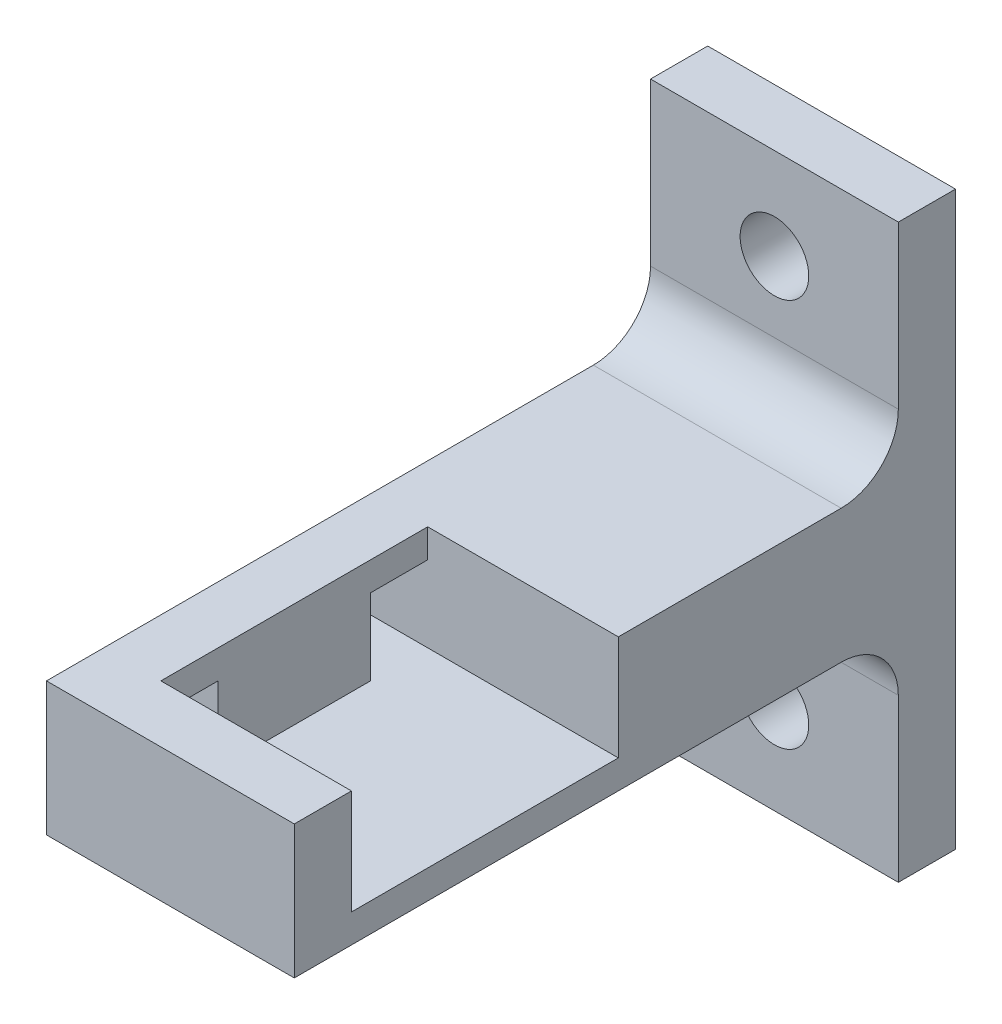
ISO-10303-21;
HEADER;
FILE_DESCRIPTION(('STEP AP214'),'2;1');
FILE_NAME('part.step','',(''),(''),'','','');
FILE_SCHEMA(('AUTOMOTIVE_DESIGN { 1 0 10303 214 1 1 1 1 }'));
ENDSEC;
DATA;
#1=APPLICATION_CONTEXT('core data for automotive mechanical design processes');
#2=APPLICATION_PROTOCOL_DEFINITION('international standard','automotive_design',2000,#1);
#3=PRODUCT_CONTEXT('',#1,'mechanical');
#4=PRODUCT('Part','Part','',(#3));
#5=PRODUCT_RELATED_PRODUCT_CATEGORY('part','',(#4));
#6=PRODUCT_DEFINITION_FORMATION('','',#4);
#7=PRODUCT_DEFINITION_CONTEXT('part definition',#1,'design');
#8=PRODUCT_DEFINITION('design','',#6,#7);
#9=PRODUCT_DEFINITION_SHAPE('','',#8);
#10=(LENGTH_UNIT() NAMED_UNIT(*) SI_UNIT(.MILLI.,.METRE.));
#11=(NAMED_UNIT(*) PLANE_ANGLE_UNIT() SI_UNIT($,.RADIAN.));
#12=(NAMED_UNIT(*) SI_UNIT($,.STERADIAN.) SOLID_ANGLE_UNIT());
#13=UNCERTAINTY_MEASURE_WITH_UNIT(LENGTH_MEASURE(1.E-05),#10,'distance_accuracy_value','');
#14=(GEOMETRIC_REPRESENTATION_CONTEXT(3) GLOBAL_UNCERTAINTY_ASSIGNED_CONTEXT((#13)) GLOBAL_UNIT_ASSIGNED_CONTEXT((#10,
#11,#12)) REPRESENTATION_CONTEXT('',''));
#15=CARTESIAN_POINT('',(0.,0.,0.));
#16=DIRECTION('',(0.,0.,1.));
#17=DIRECTION('',(1.,0.,0.));
#18=AXIS2_PLACEMENT_3D('',#15,#16,#17);
#19=CARTESIAN_POINT('',(0.,0.,3.));
#20=DIRECTION('',(0.,0.,-1.));
#21=DIRECTION('',(-1.,0.,0.));
#22=AXIS2_PLACEMENT_3D('',#19,#20,#21);
#23=PLANE('',#22);
#24=CARTESIAN_POINT('',(6.5,25.2,3.));
#25=DIRECTION('',(0.,0.,1.));
#26=DIRECTION('',(1.,0.,0.));
#27=AXIS2_PLACEMENT_3D('',#24,#25,#26);
#28=CIRCLE('',#27,1.8);
#29=CARTESIAN_POINT('',(8.3,25.2,3.));
#30=VERTEX_POINT('',#29);
#31=EDGE_CURVE('E222',#30,#30,#28,.T.);
#32=ORIENTED_EDGE('',*,*,#31,.F.);
#33=EDGE_LOOP('',(#32));
#34=FACE_BOUND('',#33,.T.);
#35=DIRECTION('',(0.,-1.,0.));
#36=VECTOR('',#35,1.);
#37=CARTESIAN_POINT('',(0.,0.,3.));
#38=LINE('',#37,#36);
#39=CARTESIAN_POINT('',(0.,30.,3.));
#40=VERTEX_POINT('',#39);
#41=CARTESIAN_POINT('',(0.,21.5,3.));
#42=VERTEX_POINT('',#41);
#43=EDGE_CURVE('E238',#40,#42,#38,.T.);
#44=ORIENTED_EDGE('',*,*,#43,.T.);
#45=DIRECTION('',(-1.,0.,0.));
#46=VECTOR('',#45,1.);
#47=CARTESIAN_POINT('',(13.,21.5,3.));
#48=LINE('',#47,#46);
#49=CARTESIAN_POINT('',(13.,21.5,3.));
#50=VERTEX_POINT('',#49);
#51=EDGE_CURVE('E53',#42,#50,#48,.F.);
#52=ORIENTED_EDGE('',*,*,#51,.T.);
#53=DIRECTION('',(0.,1.,0.));
#54=VECTOR('',#53,1.);
#55=CARTESIAN_POINT('',(13.,0.,3.));
#56=LINE('',#55,#54);
#57=CARTESIAN_POINT('',(13.,30.,3.));
#58=VERTEX_POINT('',#57);
#59=EDGE_CURVE('E247',#50,#58,#56,.T.);
#60=ORIENTED_EDGE('',*,*,#59,.T.);
#61=DIRECTION('',(-1.,0.,0.));
#62=VECTOR('',#61,1.);
#63=CARTESIAN_POINT('',(0.,30.,3.));
#64=LINE('',#63,#62);
#65=EDGE_CURVE('E246',#58,#40,#64,.T.);
#66=ORIENTED_EDGE('',*,*,#65,.T.);
#67=EDGE_LOOP('',(#44,#52,#60,#66));
#68=FACE_BOUND('',#67,.T.);
#69=ADVANCED_FACE('F32',(#34,#68),#23,.F.);
#70=CARTESIAN_POINT('',(6.5,4.8,3.));
#71=DIRECTION('',(0.,0.,1.));
#72=DIRECTION('',(1.,0.,0.));
#73=AXIS2_PLACEMENT_3D('',#70,#71,#72);
#74=CIRCLE('',#73,1.8);
#75=CARTESIAN_POINT('',(8.3,4.8,3.));
#76=VERTEX_POINT('',#75);
#77=EDGE_CURVE('E214',#76,#76,#74,.T.);
#78=ORIENTED_EDGE('',*,*,#77,.F.);
#79=EDGE_LOOP('',(#78));
#80=FACE_BOUND('',#79,.T.);
#81=CARTESIAN_POINT('',(13.,0.,3.));
#82=VERTEX_POINT('',#81);
#83=CARTESIAN_POINT('',(13.,8.5,3.));
#84=VERTEX_POINT('',#83);
#85=EDGE_CURVE('E243',#82,#84,#56,.T.);
#86=ORIENTED_EDGE('',*,*,#85,.T.);
#87=DIRECTION('',(1.,0.,0.));
#88=VECTOR('',#87,1.);
#89=CARTESIAN_POINT('',(0.,8.5,3.));
#90=LINE('',#89,#88);
#91=CARTESIAN_POINT('',(0.,8.5,3.));
#92=VERTEX_POINT('',#91);
#93=EDGE_CURVE('E281',#84,#92,#90,.F.);
#94=ORIENTED_EDGE('',*,*,#93,.T.);
#95=CARTESIAN_POINT('',(0.,0.,3.));
#96=VERTEX_POINT('',#95);
#97=EDGE_CURVE('E234',#92,#96,#38,.T.);
#98=ORIENTED_EDGE('',*,*,#97,.T.);
#99=DIRECTION('',(1.,0.,0.));
#100=VECTOR('',#99,1.);
#101=CARTESIAN_POINT('',(0.,0.,3.));
#102=LINE('',#101,#100);
#103=EDGE_CURVE('E230',#96,#82,#102,.T.);
#104=ORIENTED_EDGE('',*,*,#103,.T.);
#105=EDGE_LOOP('',(#86,#94,#98,#104));
#106=FACE_BOUND('',#105,.T.);
#107=ADVANCED_FACE('F342',(#80,#106),#23,.F.);
#108=CARTESIAN_POINT('',(0.,0.,0.));
#109=DIRECTION('',(0.,0.,-1.));
#110=DIRECTION('',(-1.,0.,0.));
#111=AXIS2_PLACEMENT_3D('',#108,#109,#110);
#112=PLANE('',#111);
#113=CARTESIAN_POINT('',(6.5,25.2,0.));
#114=DIRECTION('',(0.,0.,1.));
#115=DIRECTION('',(1.,0.,0.));
#116=AXIS2_PLACEMENT_3D('',#113,#114,#115);
#117=CIRCLE('',#116,1.8);
#118=CARTESIAN_POINT('',(8.3,25.2,0.));
#119=VERTEX_POINT('',#118);
#120=EDGE_CURVE('E217',#119,#119,#117,.T.);
#121=ORIENTED_EDGE('',*,*,#120,.T.);
#122=EDGE_LOOP('',(#121));
#123=FACE_BOUND('',#122,.T.);
#124=DIRECTION('',(0.,-1.,0.));
#125=VECTOR('',#124,1.);
#126=CARTESIAN_POINT('',(0.,0.,0.));
#127=LINE('',#126,#125);
#128=CARTESIAN_POINT('',(0.,30.,0.));
#129=VERTEX_POINT('',#128);
#130=CARTESIAN_POINT('',(0.,0.,0.));
#131=VERTEX_POINT('',#130);
#132=EDGE_CURVE('E225',#129,#131,#127,.T.);
#133=ORIENTED_EDGE('',*,*,#132,.F.);
#134=DIRECTION('',(-1.,0.,0.));
#135=VECTOR('',#134,1.);
#136=CARTESIAN_POINT('',(0.,30.,0.));
#137=LINE('',#136,#135);
#138=CARTESIAN_POINT('',(13.,30.,0.));
#139=VERTEX_POINT('',#138);
#140=EDGE_CURVE('E322',#139,#129,#137,.T.);
#141=ORIENTED_EDGE('',*,*,#140,.F.);
#142=DIRECTION('',(0.,1.,0.));
#143=VECTOR('',#142,1.);
#144=CARTESIAN_POINT('',(13.,0.,0.));
#145=LINE('',#144,#143);
#146=CARTESIAN_POINT('',(13.,0.,0.));
#147=VERTEX_POINT('',#146);
#148=EDGE_CURVE('E332',#147,#139,#145,.T.);
#149=ORIENTED_EDGE('',*,*,#148,.F.);
#150=DIRECTION('',(1.,0.,0.));
#151=VECTOR('',#150,1.);
#152=CARTESIAN_POINT('',(0.,0.,0.));
#153=LINE('',#152,#151);
#154=EDGE_CURVE('E338',#131,#147,#153,.T.);
#155=ORIENTED_EDGE('',*,*,#154,.F.);
#156=EDGE_LOOP('',(#133,#141,#149,#155));
#157=FACE_BOUND('',#156,.T.);
#158=CARTESIAN_POINT('',(6.5,4.8,0.));
#159=DIRECTION('',(0.,0.,1.));
#160=DIRECTION('',(1.,0.,0.));
#161=AXIS2_PLACEMENT_3D('',#158,#159,#160);
#162=CIRCLE('',#161,1.8);
#163=CARTESIAN_POINT('',(8.3,4.8,0.));
#164=VERTEX_POINT('',#163);
#165=EDGE_CURVE('E218',#164,#164,#162,.T.);
#166=ORIENTED_EDGE('',*,*,#165,.T.);
#167=EDGE_LOOP('',(#166));
#168=FACE_BOUND('',#167,.T.);
#169=ADVANCED_FACE('F336',(#123,#157,#168),#112,.T.);
#170=CARTESIAN_POINT('',(0.,0.,3.));
#171=DIRECTION('',(1.,0.,0.));
#172=DIRECTION('',(0.,0.,-1.));
#173=AXIS2_PLACEMENT_3D('',#170,#171,#172);
#174=PLANE('',#173);
#175=DIRECTION('',(0.,0.,1.));
#176=VECTOR('',#175,1.);
#177=CARTESIAN_POINT('',(0.,17.,3.));
#178=LINE('',#177,#176);
#179=CARTESIAN_POINT('',(0.,17.,17.69));
#180=VERTEX_POINT('',#179);
#181=CARTESIAN_POINT('',(0.,17.,20.69));
#182=VERTEX_POINT('',#181);
#183=EDGE_CURVE('E175',#180,#182,#178,.T.);
#184=ORIENTED_EDGE('',*,*,#183,.T.);
#185=DIRECTION('',(0.,-1.,0.));
#186=VECTOR('',#185,1.);
#187=CARTESIAN_POINT('',(0.,0.,20.69));
#188=LINE('',#187,#186);
#189=CARTESIAN_POINT('',(0.,13.,20.69));
#190=VERTEX_POINT('',#189);
#191=EDGE_CURVE('E608',#182,#190,#188,.T.);
#192=ORIENTED_EDGE('',*,*,#191,.T.);
#193=DIRECTION('',(0.,0.,-1.));
#194=VECTOR('',#193,1.);
#195=CARTESIAN_POINT('',(0.,13.,3.00000000000001));
#196=LINE('',#195,#194);
#197=CARTESIAN_POINT('',(0.,13.,17.69));
#198=VERTEX_POINT('',#197);
#199=EDGE_CURVE('E605',#190,#198,#196,.T.);
#200=ORIENTED_EDGE('',*,*,#199,.T.);
#201=DIRECTION('',(0.,1.,0.));
#202=VECTOR('',#201,1.);
#203=CARTESIAN_POINT('',(0.,0.,17.69));
#204=LINE('',#203,#202);
#205=EDGE_CURVE('E611',#198,#180,#204,.T.);
#206=ORIENTED_EDGE('',*,*,#205,.T.);
#207=EDGE_LOOP('',(#184,#192,#200,#206));
#208=FACE_BOUND('',#207,.T.);
#209=DIRECTION('',(0.,0.,1.));
#210=VECTOR('',#209,1.);
#211=CARTESIAN_POINT('',(0.,17.,3.));
#212=LINE('',#211,#210);
#213=CARTESIAN_POINT('',(0.,17.,28.69));
#214=VERTEX_POINT('',#213);
#215=CARTESIAN_POINT('',(0.,17.,31.69));
#216=VERTEX_POINT('',#215);
#217=EDGE_CURVE('E582',#214,#216,#212,.T.);
#218=ORIENTED_EDGE('',*,*,#217,.T.);
#219=DIRECTION('',(0.,-1.,0.));
#220=VECTOR('',#219,1.);
#221=CARTESIAN_POINT('',(0.,0.,31.69));
#222=LINE('',#221,#220);
#223=CARTESIAN_POINT('',(0.,13.,31.69));
#224=VERTEX_POINT('',#223);
#225=EDGE_CURVE('E574',#216,#224,#222,.T.);
#226=ORIENTED_EDGE('',*,*,#225,.T.);
#227=DIRECTION('',(0.,0.,-1.));
#228=VECTOR('',#227,1.);
#229=CARTESIAN_POINT('',(0.,13.,3.));
#230=LINE('',#229,#228);
#231=CARTESIAN_POINT('',(0.,13.,28.69));
#232=VERTEX_POINT('',#231);
#233=EDGE_CURVE('E588',#224,#232,#230,.T.);
#234=ORIENTED_EDGE('',*,*,#233,.T.);
#235=DIRECTION('',(0.,1.,0.));
#236=VECTOR('',#235,1.);
#237=CARTESIAN_POINT('',(0.,0.,28.69));
#238=LINE('',#237,#236);
#239=EDGE_CURVE('E585',#232,#214,#238,.T.);
#240=ORIENTED_EDGE('',*,*,#239,.T.);
#241=EDGE_LOOP('',(#218,#226,#234,#240));
#242=FACE_BOUND('',#241,.T.);
#243=ORIENTED_EDGE('',*,*,#132,.T.);
#244=DIRECTION('',(0.,0.,-1.));
#245=VECTOR('',#244,1.);
#246=CARTESIAN_POINT('',(0.,0.,3.));
#247=LINE('',#246,#245);
#248=EDGE_CURVE('E241',#96,#131,#247,.T.);
#249=ORIENTED_EDGE('',*,*,#248,.F.);
#250=ORIENTED_EDGE('',*,*,#97,.F.);
#251=CARTESIAN_POINT('',(0.,8.5,6.));
#252=DIRECTION('',(1.,0.,0.));
#253=DIRECTION('',(0.,0.,-1.));
#254=AXIS2_PLACEMENT_3D('',#251,#252,#253);
#255=CIRCLE('',#254,3.);
#256=CARTESIAN_POINT('',(0.,11.5,6.));
#257=VERTEX_POINT('',#256);
#258=EDGE_CURVE('E261',#92,#257,#255,.T.);
#259=ORIENTED_EDGE('',*,*,#258,.T.);
#260=DIRECTION('',(0.,0.,-1.));
#261=VECTOR('',#260,1.);
#262=CARTESIAN_POINT('',(0.,11.5,34.69));
#263=LINE('',#262,#261);
#264=CARTESIAN_POINT('',(0.,11.5,34.69));
#265=VERTEX_POINT('',#264);
#266=EDGE_CURVE('E221',#265,#257,#263,.T.);
#267=ORIENTED_EDGE('',*,*,#266,.F.);
#268=DIRECTION('',(0.,-1.,0.));
#269=VECTOR('',#268,1.);
#270=CARTESIAN_POINT('',(0.,11.5,34.69));
#271=LINE('',#270,#269);
#272=CARTESIAN_POINT('',(0.,18.5,34.69));
#273=VERTEX_POINT('',#272);
#274=EDGE_CURVE('E204',#273,#265,#271,.T.);
#275=ORIENTED_EDGE('',*,*,#274,.F.);
#276=DIRECTION('',(0.,0.,-1.));
#277=VECTOR('',#276,1.);
#278=CARTESIAN_POINT('',(0.,18.5,34.69));
#279=LINE('',#278,#277);
#280=CARTESIAN_POINT('',(0.,18.5,6.));
#281=VERTEX_POINT('',#280);
#282=EDGE_CURVE('E213',#273,#281,#279,.T.);
#283=ORIENTED_EDGE('',*,*,#282,.T.);
#284=CARTESIAN_POINT('',(0.,21.5,6.));
#285=DIRECTION('',(1.,0.,0.));
#286=DIRECTION('',(0.,0.,-1.));
#287=AXIS2_PLACEMENT_3D('',#284,#285,#286);
#288=CIRCLE('',#287,3.);
#289=EDGE_CURVE('E40',#281,#42,#288,.T.);
#290=ORIENTED_EDGE('',*,*,#289,.T.);
#291=ORIENTED_EDGE('',*,*,#43,.F.);
#292=DIRECTION('',(0.,0.,-1.));
#293=VECTOR('',#292,1.);
#294=CARTESIAN_POINT('',(0.,30.,3.));
#295=LINE('',#294,#293);
#296=EDGE_CURVE('E318',#40,#129,#295,.T.);
#297=ORIENTED_EDGE('',*,*,#296,.T.);
#298=EDGE_LOOP('',(#243,#249,#250,#259,#267,#275,#283,#290,#291,#297));
#299=FACE_BOUND('',#298,.T.);
#300=ADVANCED_FACE('F267',(#208,#242,#299),#174,.F.);
#301=CARTESIAN_POINT('',(0.,0.,3.));
#302=DIRECTION('',(0.,1.,0.));
#303=DIRECTION('',(0.,0.,1.));
#304=AXIS2_PLACEMENT_3D('',#301,#302,#303);
#305=PLANE('',#304);
#306=ORIENTED_EDGE('',*,*,#154,.T.);
#307=DIRECTION('',(0.,0.,-1.));
#308=VECTOR('',#307,1.);
#309=CARTESIAN_POINT('',(13.,0.,3.));
#310=LINE('',#309,#308);
#311=EDGE_CURVE('E283',#82,#147,#310,.T.);
#312=ORIENTED_EDGE('',*,*,#311,.F.);
#313=ORIENTED_EDGE('',*,*,#103,.F.);
#314=ORIENTED_EDGE('',*,*,#248,.T.);
#315=EDGE_LOOP('',(#306,#312,#313,#314));
#316=FACE_BOUND('',#315,.T.);
#317=ADVANCED_FACE('F340',(#316),#305,.F.);
#318=CARTESIAN_POINT('',(13.,0.,3.));
#319=DIRECTION('',(-1.,0.,0.));
#320=DIRECTION('',(0.,0.,1.));
#321=AXIS2_PLACEMENT_3D('',#318,#319,#320);
#322=PLANE('',#321);
#323=DIRECTION('',(0.,0.,-1.));
#324=VECTOR('',#323,1.);
#325=CARTESIAN_POINT('',(13.,13.,31.69));
#326=LINE('',#325,#324);
#327=CARTESIAN_POINT('',(13.,13.,31.69));
#328=VERTEX_POINT('',#327);
#329=CARTESIAN_POINT('',(13.,13.,17.69));
#330=VERTEX_POINT('',#329);
#331=EDGE_CURVE('E566',#328,#330,#326,.T.);
#332=ORIENTED_EDGE('',*,*,#331,.F.);
#333=DIRECTION('',(0.,1.,0.));
#334=VECTOR('',#333,1.);
#335=CARTESIAN_POINT('',(13.,13.,31.69));
#336=LINE('',#335,#334);
#337=CARTESIAN_POINT('',(13.,18.5,31.69));
#338=VERTEX_POINT('',#337);
#339=EDGE_CURVE('E198',#328,#338,#336,.T.);
#340=ORIENTED_EDGE('',*,*,#339,.T.);
#341=DIRECTION('',(0.,0.,-1.));
#342=VECTOR('',#341,1.);
#343=CARTESIAN_POINT('',(13.,18.5,34.69));
#344=LINE('',#343,#342);
#345=CARTESIAN_POINT('',(13.,18.5,34.69));
#346=VERTEX_POINT('',#345);
#347=EDGE_CURVE('E288',#346,#338,#344,.T.);
#348=ORIENTED_EDGE('',*,*,#347,.F.);
#349=DIRECTION('',(0.,1.,0.));
#350=VECTOR('',#349,1.);
#351=CARTESIAN_POINT('',(13.,11.5,34.69));
#352=LINE('',#351,#350);
#353=CARTESIAN_POINT('',(13.,11.5,34.69));
#354=VERTEX_POINT('',#353);
#355=EDGE_CURVE('E209',#354,#346,#352,.T.);
#356=ORIENTED_EDGE('',*,*,#355,.F.);
#357=DIRECTION('',(0.,0.,-1.));
#358=VECTOR('',#357,1.);
#359=CARTESIAN_POINT('',(13.,11.5,34.69));
#360=LINE('',#359,#358);
#361=CARTESIAN_POINT('',(13.,11.5,6.));
#362=VERTEX_POINT('',#361);
#363=EDGE_CURVE('E248',#354,#362,#360,.T.);
#364=ORIENTED_EDGE('',*,*,#363,.T.);
#365=CARTESIAN_POINT('',(13.,8.5,6.));
#366=DIRECTION('',(-1.,0.,0.));
#367=DIRECTION('',(0.,0.,1.));
#368=AXIS2_PLACEMENT_3D('',#365,#366,#367);
#369=CIRCLE('',#368,3.);
#370=EDGE_CURVE('E259',#362,#84,#369,.T.);
#371=ORIENTED_EDGE('',*,*,#370,.T.);
#372=ORIENTED_EDGE('',*,*,#85,.F.);
#373=ORIENTED_EDGE('',*,*,#311,.T.);
#374=ORIENTED_EDGE('',*,*,#148,.T.);
#375=DIRECTION('',(0.,0.,-1.));
#376=VECTOR('',#375,1.);
#377=CARTESIAN_POINT('',(13.,30.,3.));
#378=LINE('',#377,#376);
#379=EDGE_CURVE('E314',#58,#139,#378,.T.);
#380=ORIENTED_EDGE('',*,*,#379,.F.);
#381=ORIENTED_EDGE('',*,*,#59,.F.);
#382=CARTESIAN_POINT('',(13.,21.5,6.));
#383=DIRECTION('',(-1.,0.,0.));
#384=DIRECTION('',(0.,0.,1.));
#385=AXIS2_PLACEMENT_3D('',#382,#383,#384);
#386=CIRCLE('',#385,3.);
#387=CARTESIAN_POINT('',(13.,18.5,6.));
#388=VERTEX_POINT('',#387);
#389=EDGE_CURVE('E11',#50,#388,#386,.T.);
#390=ORIENTED_EDGE('',*,*,#389,.T.);
#391=CARTESIAN_POINT('',(13.,18.5,17.69));
#392=VERTEX_POINT('',#391);
#393=EDGE_CURVE('E285',#392,#388,#344,.T.);
#394=ORIENTED_EDGE('',*,*,#393,.F.);
#395=DIRECTION('',(0.,1.,0.));
#396=VECTOR('',#395,1.);
#397=CARTESIAN_POINT('',(13.,13.,17.69));
#398=LINE('',#397,#396);
#399=EDGE_CURVE('E196',#330,#392,#398,.T.);
#400=ORIENTED_EDGE('',*,*,#399,.F.);
#401=EDGE_LOOP('',(#332,#340,#348,#356,#364,#371,#372,#373,#374,#380,#381,#390,#394,#400));
#402=FACE_BOUND('',#401,.T.);
#403=ADVANCED_FACE('F310',(#402),#322,.F.);
#404=CARTESIAN_POINT('',(0.,30.,3.));
#405=DIRECTION('',(0.,-1.,0.));
#406=DIRECTION('',(0.,0.,-1.));
#407=AXIS2_PLACEMENT_3D('',#404,#405,#406);
#408=PLANE('',#407);
#409=ORIENTED_EDGE('',*,*,#140,.T.);
#410=ORIENTED_EDGE('',*,*,#296,.F.);
#411=ORIENTED_EDGE('',*,*,#65,.F.);
#412=ORIENTED_EDGE('',*,*,#379,.T.);
#413=EDGE_LOOP('',(#409,#410,#411,#412));
#414=FACE_BOUND('',#413,.T.);
#415=ADVANCED_FACE('F320',(#414),#408,.F.);
#416=CARTESIAN_POINT('',(6.5,25.2,3.));
#417=DIRECTION('',(0.,0.,-1.));
#418=DIRECTION('',(-1.,0.,0.));
#419=AXIS2_PLACEMENT_3D('',#416,#417,#418);
#420=CYLINDRICAL_SURFACE('',#419,1.8);
#421=ORIENTED_EDGE('',*,*,#31,.T.);
#422=EDGE_LOOP('',(#421));
#423=FACE_BOUND('',#422,.T.);
#424=ORIENTED_EDGE('',*,*,#120,.F.);
#425=EDGE_LOOP('',(#424));
#426=FACE_BOUND('',#425,.T.);
#427=ADVANCED_FACE('F355',(#423,#426),#420,.F.);
#428=CARTESIAN_POINT('',(6.5,4.8,3.));
#429=DIRECTION('',(0.,0.,-1.));
#430=DIRECTION('',(-1.,0.,0.));
#431=AXIS2_PLACEMENT_3D('',#428,#429,#430);
#432=CYLINDRICAL_SURFACE('',#431,1.8);
#433=ORIENTED_EDGE('',*,*,#77,.T.);
#434=EDGE_LOOP('',(#433));
#435=FACE_BOUND('',#434,.T.);
#436=ORIENTED_EDGE('',*,*,#165,.F.);
#437=EDGE_LOOP('',(#436));
#438=FACE_BOUND('',#437,.T.);
#439=ADVANCED_FACE('F406',(#435,#438),#432,.F.);
#440=CARTESIAN_POINT('',(0.,11.5,34.69));
#441=DIRECTION('',(0.,1.,0.));
#442=DIRECTION('',(0.,0.,1.));
#443=AXIS2_PLACEMENT_3D('',#440,#441,#442);
#444=PLANE('',#443);
#445=ORIENTED_EDGE('',*,*,#266,.T.);
#446=DIRECTION('',(1.,0.,0.));
#447=VECTOR('',#446,1.);
#448=CARTESIAN_POINT('',(13.,11.5,6.));
#449=LINE('',#448,#447);
#450=EDGE_CURVE('E277',#257,#362,#449,.T.);
#451=ORIENTED_EDGE('',*,*,#450,.T.);
#452=ORIENTED_EDGE('',*,*,#363,.F.);
#453=DIRECTION('',(1.,0.,0.));
#454=VECTOR('',#453,1.);
#455=CARTESIAN_POINT('',(0.,11.5,34.69));
#456=LINE('',#455,#454);
#457=EDGE_CURVE('E207',#265,#354,#456,.T.);
#458=ORIENTED_EDGE('',*,*,#457,.F.);
#459=EDGE_LOOP('',(#445,#451,#452,#458));
#460=FACE_BOUND('',#459,.T.);
#461=ADVANCED_FACE('F275',(#460),#444,.F.);
#462=CARTESIAN_POINT('',(0.,18.5,34.69));
#463=DIRECTION('',(0.,-1.,0.));
#464=DIRECTION('',(1.,0.,0.));
#465=AXIS2_PLACEMENT_3D('',#462,#463,#464);
#466=PLANE('',#465);
#467=ORIENTED_EDGE('',*,*,#393,.T.);
#468=DIRECTION('',(-1.,0.,0.));
#469=VECTOR('',#468,1.);
#470=CARTESIAN_POINT('',(0.,18.5,6.));
#471=LINE('',#470,#469);
#472=EDGE_CURVE('E257',#388,#281,#471,.T.);
#473=ORIENTED_EDGE('',*,*,#472,.T.);
#474=ORIENTED_EDGE('',*,*,#282,.F.);
#475=DIRECTION('',(-1.,0.,0.));
#476=VECTOR('',#475,1.);
#477=CARTESIAN_POINT('',(0.,18.5,34.69));
#478=LINE('',#477,#476);
#479=EDGE_CURVE('E211',#346,#273,#478,.T.);
#480=ORIENTED_EDGE('',*,*,#479,.F.);
#481=ORIENTED_EDGE('',*,*,#347,.T.);
#482=DIRECTION('',(1.,0.,0.));
#483=VECTOR('',#482,1.);
#484=CARTESIAN_POINT('',(13.,18.5,31.69));
#485=LINE('',#484,#483);
#486=CARTESIAN_POINT('',(3.,18.5,31.69));
#487=VERTEX_POINT('',#486);
#488=EDGE_CURVE('E564',#487,#338,#485,.T.);
#489=ORIENTED_EDGE('',*,*,#488,.F.);
#490=DIRECTION('',(0.,0.,1.));
#491=VECTOR('',#490,1.);
#492=CARTESIAN_POINT('',(3.,18.5,31.69));
#493=LINE('',#492,#491);
#494=CARTESIAN_POINT('',(3.,18.5,17.69));
#495=VERTEX_POINT('',#494);
#496=EDGE_CURVE('E565',#495,#487,#493,.T.);
#497=ORIENTED_EDGE('',*,*,#496,.F.);
#498=DIRECTION('',(-1.,0.,0.));
#499=VECTOR('',#498,1.);
#500=CARTESIAN_POINT('',(13.,18.5,17.69));
#501=LINE('',#500,#499);
#502=EDGE_CURVE('E193',#392,#495,#501,.T.);
#503=ORIENTED_EDGE('',*,*,#502,.F.);
#504=EDGE_LOOP('',(#467,#473,#474,#480,#481,#489,#497,#503));
#505=FACE_BOUND('',#504,.T.);
#506=ADVANCED_FACE('F303',(#505),#466,.F.);
#507=CARTESIAN_POINT('',(0.,0.,34.69));
#508=DIRECTION('',(0.,0.,-1.));
#509=DIRECTION('',(-1.,0.,0.));
#510=AXIS2_PLACEMENT_3D('',#507,#508,#509);
#511=PLANE('',#510);
#512=ORIENTED_EDGE('',*,*,#274,.T.);
#513=ORIENTED_EDGE('',*,*,#457,.T.);
#514=ORIENTED_EDGE('',*,*,#355,.T.);
#515=ORIENTED_EDGE('',*,*,#479,.T.);
#516=EDGE_LOOP('',(#512,#513,#514,#515));
#517=FACE_BOUND('',#516,.T.);
#518=ADVANCED_FACE('F394',(#517),#511,.F.);
#519=CARTESIAN_POINT('',(13.,13.,31.69));
#520=DIRECTION('',(0.,0.,1.));
#521=DIRECTION('',(1.,0.,0.));
#522=AXIS2_PLACEMENT_3D('',#519,#520,#521);
#523=PLANE('',#522);
#524=ORIENTED_EDGE('',*,*,#488,.T.);
#525=ORIENTED_EDGE('',*,*,#339,.F.);
#526=DIRECTION('',(1.,0.,0.));
#527=VECTOR('',#526,1.);
#528=CARTESIAN_POINT('',(13.,13.,31.69));
#529=LINE('',#528,#527);
#530=EDGE_CURVE('E200',#224,#328,#529,.T.);
#531=ORIENTED_EDGE('',*,*,#530,.F.);
#532=ORIENTED_EDGE('',*,*,#225,.F.);
#533=DIRECTION('',(1.,0.,0.));
#534=VECTOR('',#533,1.);
#535=CARTESIAN_POINT('',(-5.00000000044735E-05,17.,31.69));
#536=LINE('',#535,#534);
#537=CARTESIAN_POINT('',(3.,17.,31.69));
#538=VERTEX_POINT('',#537);
#539=EDGE_CURVE('E591',#216,#538,#536,.T.);
#540=ORIENTED_EDGE('',*,*,#539,.T.);
#541=DIRECTION('',(0.,1.,0.));
#542=VECTOR('',#541,1.);
#543=CARTESIAN_POINT('',(3.,13.,31.69));
#544=LINE('',#543,#542);
#545=EDGE_CURVE('E195',#538,#487,#544,.T.);
#546=ORIENTED_EDGE('',*,*,#545,.T.);
#547=EDGE_LOOP('',(#524,#525,#531,#532,#540,#546));
#548=FACE_BOUND('',#547,.T.);
#549=ADVANCED_FACE('F391',(#548),#523,.F.);
#550=CARTESIAN_POINT('',(3.,13.,31.69));
#551=DIRECTION('',(-1.,0.,0.));
#552=DIRECTION('',(0.,-1.,0.));
#553=AXIS2_PLACEMENT_3D('',#550,#551,#552);
#554=PLANE('',#553);
#555=DIRECTION('',(0.,0.,1.));
#556=VECTOR('',#555,1.);
#557=CARTESIAN_POINT('',(3.,13.,31.69));
#558=LINE('',#557,#556);
#559=CARTESIAN_POINT('',(3.,13.,20.69));
#560=VERTEX_POINT('',#559);
#561=CARTESIAN_POINT('',(3.,13.,28.69));
#562=VERTEX_POINT('',#561);
#563=EDGE_CURVE('E577',#560,#562,#558,.T.);
#564=ORIENTED_EDGE('',*,*,#563,.F.);
#565=DIRECTION('',(0.,-1.,0.));
#566=VECTOR('',#565,1.);
#567=CARTESIAN_POINT('',(3.,13.,20.69));
#568=LINE('',#567,#566);
#569=CARTESIAN_POINT('',(3.,17.,20.69));
#570=VERTEX_POINT('',#569);
#571=EDGE_CURVE('E189',#570,#560,#568,.T.);
#572=ORIENTED_EDGE('',*,*,#571,.F.);
#573=DIRECTION('',(0.,0.,1.));
#574=VECTOR('',#573,1.);
#575=CARTESIAN_POINT('',(3.,17.,20.69));
#576=LINE('',#575,#574);
#577=CARTESIAN_POINT('',(3.,17.,17.69));
#578=VERTEX_POINT('',#577);
#579=EDGE_CURVE('E172',#578,#570,#576,.T.);
#580=ORIENTED_EDGE('',*,*,#579,.F.);
#581=DIRECTION('',(0.,1.,0.));
#582=VECTOR('',#581,1.);
#583=CARTESIAN_POINT('',(3.,13.,17.69));
#584=LINE('',#583,#582);
#585=EDGE_CURVE('E187',#578,#495,#584,.T.);
#586=ORIENTED_EDGE('',*,*,#585,.T.);
#587=ORIENTED_EDGE('',*,*,#496,.T.);
#588=ORIENTED_EDGE('',*,*,#545,.F.);
#589=DIRECTION('',(0.,0.,1.));
#590=VECTOR('',#589,1.);
#591=CARTESIAN_POINT('',(3.,17.,31.69));
#592=LINE('',#591,#590);
#593=CARTESIAN_POINT('',(3.,17.,28.69));
#594=VERTEX_POINT('',#593);
#595=EDGE_CURVE('E596',#594,#538,#592,.T.);
#596=ORIENTED_EDGE('',*,*,#595,.F.);
#597=DIRECTION('',(0.,1.,0.));
#598=VECTOR('',#597,1.);
#599=CARTESIAN_POINT('',(3.,13.,28.69));
#600=LINE('',#599,#598);
#601=EDGE_CURVE('E601',#562,#594,#600,.T.);
#602=ORIENTED_EDGE('',*,*,#601,.F.);
#603=EDGE_LOOP('',(#564,#572,#580,#586,#587,#588,#596,#602));
#604=FACE_BOUND('',#603,.T.);
#605=ADVANCED_FACE('F185',(#604),#554,.F.);
#606=CARTESIAN_POINT('',(13.,13.,17.69));
#607=DIRECTION('',(0.,0.,-1.));
#608=DIRECTION('',(-1.,0.,0.));
#609=AXIS2_PLACEMENT_3D('',#606,#607,#608);
#610=PLANE('',#609);
#611=ORIENTED_EDGE('',*,*,#502,.T.);
#612=ORIENTED_EDGE('',*,*,#585,.F.);
#613=DIRECTION('',(1.,0.,0.));
#614=VECTOR('',#613,1.);
#615=CARTESIAN_POINT('',(-5.00000000044735E-05,17.,17.69));
#616=LINE('',#615,#614);
#617=EDGE_CURVE('E168',#180,#578,#616,.T.);
#618=ORIENTED_EDGE('',*,*,#617,.F.);
#619=ORIENTED_EDGE('',*,*,#205,.F.);
#620=DIRECTION('',(-1.,0.,0.));
#621=VECTOR('',#620,1.);
#622=CARTESIAN_POINT('',(13.,13.,17.69));
#623=LINE('',#622,#621);
#624=EDGE_CURVE('E569',#330,#198,#623,.T.);
#625=ORIENTED_EDGE('',*,*,#624,.F.);
#626=ORIENTED_EDGE('',*,*,#399,.T.);
#627=EDGE_LOOP('',(#611,#612,#618,#619,#625,#626));
#628=FACE_BOUND('',#627,.T.);
#629=ADVANCED_FACE('F191',(#628),#610,.F.);
#630=CARTESIAN_POINT('',(0.,13.,0.));
#631=DIRECTION('',(0.,1.,0.));
#632=DIRECTION('',(-1.,0.,0.));
#633=AXIS2_PLACEMENT_3D('',#630,#631,#632);
#634=PLANE('',#633);
#635=ORIENTED_EDGE('',*,*,#331,.T.);
#636=ORIENTED_EDGE('',*,*,#624,.T.);
#637=ORIENTED_EDGE('',*,*,#199,.F.);
#638=DIRECTION('',(1.,0.,0.));
#639=VECTOR('',#638,1.);
#640=CARTESIAN_POINT('',(-5.00000000036062E-05,13.,20.69));
#641=LINE('',#640,#639);
#642=EDGE_CURVE('E181',#190,#560,#641,.T.);
#643=ORIENTED_EDGE('',*,*,#642,.T.);
#644=ORIENTED_EDGE('',*,*,#563,.T.);
#645=DIRECTION('',(1.,0.,0.));
#646=VECTOR('',#645,1.);
#647=CARTESIAN_POINT('',(-5.00000000036062E-05,13.,28.69));
#648=LINE('',#647,#646);
#649=EDGE_CURVE('E592',#232,#562,#648,.T.);
#650=ORIENTED_EDGE('',*,*,#649,.F.);
#651=ORIENTED_EDGE('',*,*,#233,.F.);
#652=ORIENTED_EDGE('',*,*,#530,.T.);
#653=EDGE_LOOP('',(#635,#636,#637,#643,#644,#650,#651,#652));
#654=FACE_BOUND('',#653,.T.);
#655=ADVANCED_FACE('F383',(#654),#634,.T.);
#656=CARTESIAN_POINT('',(-5.00000000044735E-05,17.,31.69));
#657=DIRECTION('',(0.,1.,0.));
#658=DIRECTION('',(-1.,0.,0.));
#659=AXIS2_PLACEMENT_3D('',#656,#657,#658);
#660=PLANE('',#659);
#661=DIRECTION('',(1.,0.,0.));
#662=VECTOR('',#661,1.);
#663=CARTESIAN_POINT('',(-5.00000000044735E-05,17.,28.69));
#664=LINE('',#663,#662);
#665=EDGE_CURVE('E595',#214,#594,#664,.T.);
#666=ORIENTED_EDGE('',*,*,#665,.T.);
#667=ORIENTED_EDGE('',*,*,#595,.T.);
#668=ORIENTED_EDGE('',*,*,#539,.F.);
#669=ORIENTED_EDGE('',*,*,#217,.F.);
#670=EDGE_LOOP('',(#666,#667,#668,#669));
#671=FACE_BOUND('',#670,.T.);
#672=ADVANCED_FACE('F380',(#671),#660,.F.);
#673=CARTESIAN_POINT('',(-5.00000000036062E-05,13.,28.69));
#674=DIRECTION('',(0.,0.,-1.));
#675=DIRECTION('',(-1.,0.,0.));
#676=AXIS2_PLACEMENT_3D('',#673,#674,#675);
#677=PLANE('',#676);
#678=ORIENTED_EDGE('',*,*,#649,.T.);
#679=ORIENTED_EDGE('',*,*,#601,.T.);
#680=ORIENTED_EDGE('',*,*,#665,.F.);
#681=ORIENTED_EDGE('',*,*,#239,.F.);
#682=EDGE_LOOP('',(#678,#679,#680,#681));
#683=FACE_BOUND('',#682,.T.);
#684=ADVANCED_FACE('F377',(#683),#677,.F.);
#685=CARTESIAN_POINT('',(-5.00000000044735E-05,17.,20.69));
#686=DIRECTION('',(0.,1.,0.));
#687=DIRECTION('',(-1.,0.,0.));
#688=AXIS2_PLACEMENT_3D('',#685,#686,#687);
#689=PLANE('',#688);
#690=ORIENTED_EDGE('',*,*,#617,.T.);
#691=ORIENTED_EDGE('',*,*,#579,.T.);
#692=DIRECTION('',(1.,0.,0.));
#693=VECTOR('',#692,1.);
#694=CARTESIAN_POINT('',(-5.00000000044735E-05,17.,20.69));
#695=LINE('',#694,#693);
#696=EDGE_CURVE('E180',#182,#570,#695,.T.);
#697=ORIENTED_EDGE('',*,*,#696,.F.);
#698=ORIENTED_EDGE('',*,*,#183,.F.);
#699=EDGE_LOOP('',(#690,#691,#697,#698));
#700=FACE_BOUND('',#699,.T.);
#701=ADVANCED_FACE('F170',(#700),#689,.F.);
#702=CARTESIAN_POINT('',(-5.00000000036062E-05,13.,20.69));
#703=DIRECTION('',(0.,0.,1.));
#704=DIRECTION('',(1.,0.,0.));
#705=AXIS2_PLACEMENT_3D('',#702,#703,#704);
#706=PLANE('',#705);
#707=ORIENTED_EDGE('',*,*,#696,.T.);
#708=ORIENTED_EDGE('',*,*,#571,.T.);
#709=ORIENTED_EDGE('',*,*,#642,.F.);
#710=ORIENTED_EDGE('',*,*,#191,.F.);
#711=EDGE_LOOP('',(#707,#708,#709,#710));
#712=FACE_BOUND('',#711,.T.);
#713=ADVANCED_FACE('F367',(#712),#706,.F.);
#714=CARTESIAN_POINT('',(0.,8.5,6.));
#715=DIRECTION('',(-1.,0.,0.));
#716=DIRECTION('',(0.,0.,1.));
#717=AXIS2_PLACEMENT_3D('',#714,#715,#716);
#718=CYLINDRICAL_SURFACE('',#717,3.);
#719=ORIENTED_EDGE('',*,*,#258,.F.);
#720=ORIENTED_EDGE('',*,*,#93,.F.);
#721=ORIENTED_EDGE('',*,*,#370,.F.);
#722=ORIENTED_EDGE('',*,*,#450,.F.);
#723=EDGE_LOOP('',(#719,#720,#721,#722));
#724=FACE_BOUND('',#723,.T.);
#725=ADVANCED_FACE('F280',(#724),#718,.F.);
#726=CARTESIAN_POINT('',(0.,21.5,6.));
#727=DIRECTION('',(1.,0.,0.));
#728=DIRECTION('',(0.,1.,0.));
#729=AXIS2_PLACEMENT_3D('',#726,#727,#728);
#730=CYLINDRICAL_SURFACE('',#729,3.);
#731=ORIENTED_EDGE('',*,*,#389,.F.);
#732=ORIENTED_EDGE('',*,*,#51,.F.);
#733=ORIENTED_EDGE('',*,*,#289,.F.);
#734=ORIENTED_EDGE('',*,*,#472,.F.);
#735=EDGE_LOOP('',(#731,#732,#733,#734));
#736=FACE_BOUND('',#735,.T.);
#737=ADVANCED_FACE('F34',(#736),#730,.F.);
#738=CLOSED_SHELL('',(#69,#107,#169,#300,#317,#403,#415,#427,#439,#461,#506,#518,#549,#605,#629,
#655,#672,#684,#701,#713,#725,#737));
#739=MANIFOLD_SOLID_BREP('B2',#738);
#740=ADVANCED_BREP_SHAPE_REPRESENTATION('',(#18,#739),#14);
#741=SHAPE_DEFINITION_REPRESENTATION(#9,#740);
ENDSEC;
END-ISO-10303-21;
